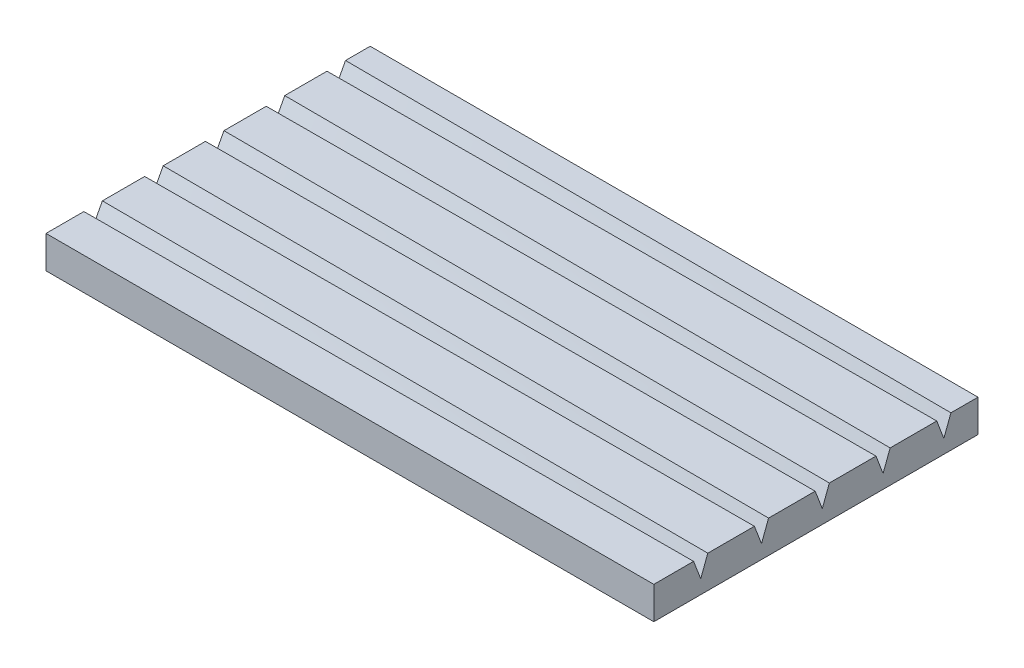
ISO-10303-21;
HEADER;
FILE_DESCRIPTION(('STEP AP214'),'2;1');
FILE_NAME('part.step','',(''),(''),'','','');
FILE_SCHEMA(('AUTOMOTIVE_DESIGN { 1 0 10303 214 1 1 1 1 }'));
ENDSEC;
DATA;
#1=APPLICATION_CONTEXT('core data for automotive mechanical design processes');
#2=APPLICATION_PROTOCOL_DEFINITION('international standard','automotive_design',2000,#1);
#3=PRODUCT_CONTEXT('',#1,'mechanical');
#4=PRODUCT('Part','Part','',(#3));
#5=PRODUCT_RELATED_PRODUCT_CATEGORY('part','',(#4));
#6=PRODUCT_DEFINITION_FORMATION('','',#4);
#7=PRODUCT_DEFINITION_CONTEXT('part definition',#1,'design');
#8=PRODUCT_DEFINITION('design','',#6,#7);
#9=PRODUCT_DEFINITION_SHAPE('','',#8);
#10=(LENGTH_UNIT() NAMED_UNIT(*) SI_UNIT(.MILLI.,.METRE.));
#11=(NAMED_UNIT(*) PLANE_ANGLE_UNIT() SI_UNIT($,.RADIAN.));
#12=(NAMED_UNIT(*) SI_UNIT($,.STERADIAN.) SOLID_ANGLE_UNIT());
#13=UNCERTAINTY_MEASURE_WITH_UNIT(LENGTH_MEASURE(1.E-05),#10,'distance_accuracy_value','');
#14=(GEOMETRIC_REPRESENTATION_CONTEXT(3) GLOBAL_UNCERTAINTY_ASSIGNED_CONTEXT((#13)) GLOBAL_UNIT_ASSIGNED_CONTEXT((#10,
#11,#12)) REPRESENTATION_CONTEXT('',''));
#15=CARTESIAN_POINT('',(0.,0.,0.));
#16=DIRECTION('',(0.,0.,1.));
#17=DIRECTION('',(1.,0.,0.));
#18=AXIS2_PLACEMENT_3D('',#15,#16,#17);
#19=CARTESIAN_POINT('',(0.,8.,0.));
#20=DIRECTION('',(0.,1.,0.));
#21=DIRECTION('',(0.,0.,1.));
#22=AXIS2_PLACEMENT_3D('',#19,#20,#21);
#23=PLANE('',#22);
#24=CARTESIAN_POINT('',(74.7649374249261,8.,26.7048154675276));
#25=CARTESIAN_POINT('',(70.9934003587847,8.,26.6897343569756));
#26=CARTESIAN_POINT('',(67.2218632607946,8.,26.6746612097736));
#27=CARTESIAN_POINT('',(55.9072518713356,8.,26.6294656582195));
#28=CARTESIAN_POINT('',(48.3641774844286,8.,26.5993671439193));
#29=CARTESIAN_POINT('',(33.2780284566883,8.00000000000001,26.5392338221327));
#30=CARTESIAN_POINT('',(25.7349538158551,8.,26.5091990146463));
#31=CARTESIAN_POINT('',(10.4063011195098,8.,26.4482285381422));
#32=CARTESIAN_POINT('',(2.62072305572011,8.,26.4172949501649));
#33=CARTESIAN_POINT('',(-12.9504333412093,8.,26.3554956431228));
#34=CARTESIAN_POINT('',(-20.7360116743489,8.,26.3246299240582));
#35=CARTESIAN_POINT('',(-44.0927470827409,8.00000000000001,26.232134570224));
#36=CARTESIAN_POINT('',(-59.6639045611979,8.00000000000002,26.1706067388374));
#37=CARTESIAN_POINT('',(-75.2350625750739,8.,26.1092146453315));
#38=B_SPLINE_CURVE_WITH_KNOTS('',3,(#24,#25,#26,#27,#28,#29,#30,#31,#32,#33,#34,#35,#36,#37),
.UNSPECIFIED.,.F.,.F.,(4,2,2,2,2,2,4),(0.,11.3147016545169,33.9441049637019,56.573508272887,
79.9304268207998,103.287345368712,150.001182481843),.UNSPECIFIED.);
#39=CARTESIAN_POINT('',(74.7649374249261,8.,26.7048154675276));
#40=VERTEX_POINT('',#39);
#41=CARTESIAN_POINT('',(-75.2350625750739,8.,26.1092146453315));
#42=VERTEX_POINT('',#41);
#43=EDGE_CURVE('E12',#40,#42,#38,.T.);
#44=ORIENTED_EDGE('',*,*,#43,.F.);
#45=DIRECTION('',(0.,0.,-1.));
#46=VECTOR('',#45,1.);
#47=CARTESIAN_POINT('',(74.7649374249261,8.,-39.9777784756404));
#48=LINE('',#47,#46);
#49=CARTESIAN_POINT('',(74.7649374249261,8.,15.1994731491376));
#50=VERTEX_POINT('',#49);
#51=EDGE_CURVE('E290',#40,#50,#48,.T.);
#52=ORIENTED_EDGE('',*,*,#51,.T.);
#53=CARTESIAN_POINT('',(-75.2350625750739,8.,15.6793368432754));
#54=CARTESIAN_POINT('',(-71.5510321467159,8.,15.6676138720796));
#55=CARTESIAN_POINT('',(-67.8670017330216,8.,15.6558862901102));
#56=CARTESIAN_POINT('',(-49.4468497377665,8.,15.5972253263962));
#57=CARTESIAN_POINT('',(-34.7107283763746,8.00000000000001,15.5502227830518));
#58=CARTESIAN_POINT('',(-12.6065466879932,8.,15.4796083094906));
#59=CARTESIAN_POINT('',(-5.23848618418517,8.,15.4560517085462));
#60=CARTESIAN_POINT('',(14.2354684400598,8.,15.3937423204483));
#61=CARTESIAN_POINT('',(26.3413624602254,8.,15.3549581887989));
#62=CARTESIAN_POINT('',(50.5531501819531,8.,15.2772903503372));
#63=CARTESIAN_POINT('',(62.6590438835153,8.,15.2384066435248));
#64=CARTESIAN_POINT('',(74.7649374249261,8.,15.1994731491376));
#65=B_SPLINE_CURVE_WITH_KNOTS('',3,(#53,#54,#55,#56,#57,#58,#59,#60,#61,#62,#63,#64),
.UNSPECIFIED.,.F.,.F.,(4,2,2,2,2,4),(0.,11.0521472405373,55.2607362032059,77.3650306843325,
113.682899125296,150.000767568717),.UNSPECIFIED.);
#66=CARTESIAN_POINT('',(-75.2350625750739,8.,15.6793368432754));
#67=VERTEX_POINT('',#66);
#68=EDGE_CURVE('E328',#67,#50,#65,.T.);
#69=ORIENTED_EDGE('',*,*,#68,.F.);
#70=DIRECTION('',(0.,0.,1.));
#71=VECTOR('',#70,1.);
#72=CARTESIAN_POINT('',(-75.2350625750739,8.,-39.9777784756404));
#73=LINE('',#72,#71);
#74=EDGE_CURVE('E326',#67,#42,#73,.T.);
#75=ORIENTED_EDGE('',*,*,#74,.T.);
#76=EDGE_LOOP('',(#44,#52,#69,#75));
#77=FACE_BOUND('',#76,.T.);
#78=ADVANCED_FACE('F75',(#77),#23,.T.);
#79=CARTESIAN_POINT('',(74.7649374249261,8.,11.7048154675276));
#80=CARTESIAN_POINT('',(70.9934003587847,8.,11.6897343569756));
#81=CARTESIAN_POINT('',(67.2218632607946,8.,11.6746612097736));
#82=CARTESIAN_POINT('',(55.9072518713356,8.,11.6294656582195));
#83=CARTESIAN_POINT('',(48.3641774844286,8.,11.5993671439193));
#84=CARTESIAN_POINT('',(33.2780284566883,8.00000000000001,11.5392338221327));
#85=CARTESIAN_POINT('',(25.7349538158551,8.,11.5091990146463));
#86=CARTESIAN_POINT('',(10.4063011195098,8.,11.4482285381422));
#87=CARTESIAN_POINT('',(2.62072305572011,8.,11.4172949501649));
#88=CARTESIAN_POINT('',(-12.9504333412093,8.,11.3554956431228));
#89=CARTESIAN_POINT('',(-20.7360116743489,8.,11.3246299240582));
#90=CARTESIAN_POINT('',(-44.0927470827409,8.00000000000001,11.232134570224));
#91=CARTESIAN_POINT('',(-59.6639045611979,8.00000000000002,11.1706067388375));
#92=CARTESIAN_POINT('',(-75.2350625750739,8.,11.1092146453315));
#93=B_SPLINE_CURVE_WITH_KNOTS('',3,(#79,#80,#81,#82,#83,#84,#85,#86,#87,#88,#89,#90,#91,#92),
.UNSPECIFIED.,.F.,.F.,(4,2,2,2,2,2,4),(0.,11.3147016545169,33.9441049637019,56.573508272887,
79.9304268207998,103.287345368712,150.001182481843),.UNSPECIFIED.);
#94=CARTESIAN_POINT('',(74.7649374249261,8.,11.7048154675276));
#95=VERTEX_POINT('',#94);
#96=CARTESIAN_POINT('',(-75.2350625750739,8.,11.1092146453315));
#97=VERTEX_POINT('',#96);
#98=EDGE_CURVE('E289',#95,#97,#93,.T.);
#99=ORIENTED_EDGE('',*,*,#98,.F.);
#100=CARTESIAN_POINT('',(74.7649374249261,8.,0.199473149137583));
#101=VERTEX_POINT('',#100);
#102=EDGE_CURVE('E295',#95,#101,#48,.T.);
#103=ORIENTED_EDGE('',*,*,#102,.T.);
#104=CARTESIAN_POINT('',(-75.2350625750739,8.,0.679336843275438));
#105=CARTESIAN_POINT('',(-71.5510321467159,8.,0.667613872079558));
#106=CARTESIAN_POINT('',(-67.8670017330216,8.,0.6558862901102));
#107=CARTESIAN_POINT('',(-49.4468497377665,8.,0.597225326396249));
#108=CARTESIAN_POINT('',(-34.7107283763746,8.00000000000001,0.550222783051821));
#109=CARTESIAN_POINT('',(-12.6065466879932,8.,0.479608309490626));
#110=CARTESIAN_POINT('',(-5.23848618418517,8.,0.456051708546246));
#111=CARTESIAN_POINT('',(14.2354684400598,8.,0.393742320448316));
#112=CARTESIAN_POINT('',(26.3413624602254,8.,0.354958188798946));
#113=CARTESIAN_POINT('',(50.5531501819531,8.,0.277290350337199));
#114=CARTESIAN_POINT('',(62.6590438835153,8.,0.238406643524816));
#115=CARTESIAN_POINT('',(74.7649374249261,8.,0.199473149137583));
#116=B_SPLINE_CURVE_WITH_KNOTS('',3,(#104,#105,#106,#107,#108,#109,#110,#111,#112,#113,#114,
#115),.UNSPECIFIED.,.F.,.F.,(4,2,2,2,2,4),(0.,11.0521472405373,55.2607362032059,
77.3650306843325,113.682899125296,150.000767568717),.UNSPECIFIED.);
#117=CARTESIAN_POINT('',(-75.2350625750739,8.,0.679336843275438));
#118=VERTEX_POINT('',#117);
#119=EDGE_CURVE('E559',#118,#101,#116,.T.);
#120=ORIENTED_EDGE('',*,*,#119,.F.);
#121=EDGE_CURVE('E438',#118,#97,#73,.T.);
#122=ORIENTED_EDGE('',*,*,#121,.T.);
#123=EDGE_LOOP('',(#99,#103,#120,#122));
#124=FACE_BOUND('',#123,.T.);
#125=ADVANCED_FACE('F626',(#124),#23,.T.);
#126=CARTESIAN_POINT('',(74.7649374249261,8.,-3.29518453247239));
#127=CARTESIAN_POINT('',(70.9934003587847,8.,-3.31026564302442));
#128=CARTESIAN_POINT('',(67.2218632607946,8.,-3.32533879022637));
#129=CARTESIAN_POINT('',(55.9072518713356,8.,-3.37053434178047));
#130=CARTESIAN_POINT('',(48.3641774844286,8.,-3.4006328560807));
#131=CARTESIAN_POINT('',(33.2780284566883,8.00000000000001,-3.4607661778673));
#132=CARTESIAN_POINT('',(25.7349538158551,8.,-3.49080098535366));
#133=CARTESIAN_POINT('',(10.4063011195098,8.,-3.55177146185777));
#134=CARTESIAN_POINT('',(2.62072305572011,8.,-3.58270504983512));
#135=CARTESIAN_POINT('',(-12.9504333412093,8.,-3.64450435687715));
#136=CARTESIAN_POINT('',(-20.7360116743489,8.,-3.67537007594184));
#137=CARTESIAN_POINT('',(-44.0927470827409,8.00000000000001,-3.76786542977598));
#138=CARTESIAN_POINT('',(-59.6639045611979,8.00000000000002,-3.82939326116255));
#139=CARTESIAN_POINT('',(-75.2350625750739,8.,-3.89078535466853));
#140=B_SPLINE_CURVE_WITH_KNOTS('',3,(#126,#127,#128,#129,#130,#131,#132,#133,#134,#135,#136,
#137,#138,#139),.UNSPECIFIED.,.F.,.F.,(4,2,2,2,2,2,4),(0.,11.3147016545169,33.9441049637019,
56.573508272887,79.9304268207998,103.287345368712,150.001182481843),.UNSPECIFIED.);
#141=CARTESIAN_POINT('',(74.7649374249261,8.00000000000001,-3.29518453247239));
#142=VERTEX_POINT('',#141);
#143=CARTESIAN_POINT('',(-75.2350625750739,8.,-3.89078535466853));
#144=VERTEX_POINT('',#143);
#145=EDGE_CURVE('E331',#142,#144,#140,.T.);
#146=ORIENTED_EDGE('',*,*,#145,.F.);
#147=CARTESIAN_POINT('',(74.7649374249261,8.,-14.8005268508624));
#148=VERTEX_POINT('',#147);
#149=EDGE_CURVE('E319',#142,#148,#48,.T.);
#150=ORIENTED_EDGE('',*,*,#149,.T.);
#151=CARTESIAN_POINT('',(-75.2350625750739,8.,-14.3206631567246));
#152=CARTESIAN_POINT('',(-71.5510321467159,8.,-14.3323861279204));
#153=CARTESIAN_POINT('',(-67.8670017330216,8.,-14.3441137098898));
#154=CARTESIAN_POINT('',(-49.4468497377665,8.,-14.4027746736038));
#155=CARTESIAN_POINT('',(-34.7107283763746,8.,-14.4497772169482));
#156=CARTESIAN_POINT('',(-12.6065466879932,8.,-14.5203916905094));
#157=CARTESIAN_POINT('',(-5.23848618418517,8.,-14.5439482914538));
#158=CARTESIAN_POINT('',(14.2354684400598,8.,-14.6062576795517));
#159=CARTESIAN_POINT('',(26.3413624602254,8.,-14.6450418112011));
#160=CARTESIAN_POINT('',(50.5531501819531,8.,-14.7227096496628));
#161=CARTESIAN_POINT('',(62.6590438835153,8.,-14.7615933564752));
#162=CARTESIAN_POINT('',(74.7649374249261,8.,-14.8005268508624));
#163=B_SPLINE_CURVE_WITH_KNOTS('',3,(#151,#152,#153,#154,#155,#156,#157,#158,#159,#160,#161,
#162),.UNSPECIFIED.,.F.,.F.,(4,2,2,2,2,4),(0.,11.0521472405373,55.2607362032059,
77.3650306843325,113.682899125296,150.000767568717),.UNSPECIFIED.);
#164=CARTESIAN_POINT('',(-75.2350625750739,8.,-14.3206631567246));
#165=VERTEX_POINT('',#164);
#166=EDGE_CURVE('E552',#165,#148,#163,.T.);
#167=ORIENTED_EDGE('',*,*,#166,.F.);
#168=EDGE_CURVE('E441',#165,#144,#73,.T.);
#169=ORIENTED_EDGE('',*,*,#168,.T.);
#170=EDGE_LOOP('',(#146,#150,#167,#169));
#171=FACE_BOUND('',#170,.T.);
#172=ADVANCED_FACE('F619',(#171),#23,.T.);
#173=CARTESIAN_POINT('',(74.7649374249261,8.,-18.2951845324724));
#174=CARTESIAN_POINT('',(70.9934003587847,8.,-18.3102656430244));
#175=CARTESIAN_POINT('',(67.2218632607946,8.,-18.3253387902264));
#176=CARTESIAN_POINT('',(55.9072518713356,8.,-18.3705343417805));
#177=CARTESIAN_POINT('',(48.3641774844286,8.,-18.4006328560807));
#178=CARTESIAN_POINT('',(33.2780284566883,8.00000000000001,-18.4607661778673));
#179=CARTESIAN_POINT('',(25.7349538158551,8.,-18.4908009853537));
#180=CARTESIAN_POINT('',(10.4063011195098,8.,-18.5517714618578));
#181=CARTESIAN_POINT('',(2.62072305572011,8.,-18.5827050498351));
#182=CARTESIAN_POINT('',(-12.9504333412093,8.,-18.6445043568772));
#183=CARTESIAN_POINT('',(-20.7360116743489,8.,-18.6753700759418));
#184=CARTESIAN_POINT('',(-44.0927470827409,8.00000000000001,-18.767865429776));
#185=CARTESIAN_POINT('',(-59.6639045611979,8.00000000000002,-18.8293932611625));
#186=CARTESIAN_POINT('',(-75.2350625750739,8.,-18.8907853546685));
#187=B_SPLINE_CURVE_WITH_KNOTS('',3,(#173,#174,#175,#176,#177,#178,#179,#180,#181,#182,#183,
#184,#185,#186),.UNSPECIFIED.,.F.,.F.,(4,2,2,2,2,2,4),(0.,11.3147016545169,33.9441049637019,
56.573508272887,79.9304268207998,103.287345368712,150.001182481843),.UNSPECIFIED.);
#188=CARTESIAN_POINT('',(74.7649374249261,8.,-18.2951845324724));
#189=VERTEX_POINT('',#188);
#190=CARTESIAN_POINT('',(-75.2350625750739,8.,-18.8907853546685));
#191=VERTEX_POINT('',#190);
#192=EDGE_CURVE('E517',#189,#191,#187,.T.);
#193=ORIENTED_EDGE('',*,*,#192,.F.);
#194=CARTESIAN_POINT('',(74.7649374249261,8.,-29.8005268508624));
#195=VERTEX_POINT('',#194);
#196=EDGE_CURVE('E315',#189,#195,#48,.T.);
#197=ORIENTED_EDGE('',*,*,#196,.T.);
#198=CARTESIAN_POINT('',(-75.2350625750739,8.,-29.3206631567246));
#199=CARTESIAN_POINT('',(-71.5510321467159,8.,-29.3323861279204));
#200=CARTESIAN_POINT('',(-67.8670017330216,8.,-29.3441137098898));
#201=CARTESIAN_POINT('',(-49.4468497377665,8.,-29.4027746736038));
#202=CARTESIAN_POINT('',(-34.7107283763746,8.,-29.4497772169482));
#203=CARTESIAN_POINT('',(-12.6065466879932,8.,-29.5203916905094));
#204=CARTESIAN_POINT('',(-5.23848618418517,8.,-29.5439482914538));
#205=CARTESIAN_POINT('',(14.2354684400598,8.,-29.6062576795517));
#206=CARTESIAN_POINT('',(26.3413624602254,8.,-29.6450418112011));
#207=CARTESIAN_POINT('',(50.5531501819531,8.,-29.7227096496628));
#208=CARTESIAN_POINT('',(62.6590438835154,8.,-29.7615933564752));
#209=CARTESIAN_POINT('',(74.7649374249261,8.,-29.8005268508624));
#210=B_SPLINE_CURVE_WITH_KNOTS('',3,(#198,#199,#200,#201,#202,#203,#204,#205,#206,#207,#208,
#209),.UNSPECIFIED.,.F.,.F.,(4,2,2,2,2,4),(0.,11.0521472405373,55.2607362032059,
77.3650306843325,113.682899125296,150.000767568717),.UNSPECIFIED.);
#211=CARTESIAN_POINT('',(-75.2350625750739,8.,-29.3206631567246));
#212=VERTEX_POINT('',#211);
#213=EDGE_CURVE('E472',#212,#195,#210,.T.);
#214=ORIENTED_EDGE('',*,*,#213,.F.);
#215=EDGE_CURVE('E476',#212,#191,#73,.T.);
#216=ORIENTED_EDGE('',*,*,#215,.T.);
#217=EDGE_LOOP('',(#193,#197,#214,#216));
#218=FACE_BOUND('',#217,.T.);
#219=ADVANCED_FACE('F663',(#218),#23,.T.);
#220=CARTESIAN_POINT('',(74.7649374249261,8.,-33.2951845324724));
#221=CARTESIAN_POINT('',(70.9934003587847,8.,-33.3102656430244));
#222=CARTESIAN_POINT('',(67.2218632607946,8.,-33.3253387902264));
#223=CARTESIAN_POINT('',(55.9072518713356,8.,-33.3705343417805));
#224=CARTESIAN_POINT('',(48.3641774844286,8.,-33.4006328560807));
#225=CARTESIAN_POINT('',(33.2780284566883,8.00000000000001,-33.4607661778673));
#226=CARTESIAN_POINT('',(25.7349538158551,8.,-33.4908009853537));
#227=CARTESIAN_POINT('',(10.4063011195098,8.,-33.5517714618578));
#228=CARTESIAN_POINT('',(2.6207230557201,8.,-33.5827050498351));
#229=CARTESIAN_POINT('',(-12.9504333412093,8.,-33.6445043568771));
#230=CARTESIAN_POINT('',(-20.7360116743489,8.,-33.6753700759418));
#231=CARTESIAN_POINT('',(-44.0927470827409,8.00000000000001,-33.767865429776));
#232=CARTESIAN_POINT('',(-59.663904561198,8.00000000000002,-33.8293932611626));
#233=CARTESIAN_POINT('',(-75.2350625750739,8.,-33.8907853546685));
#234=B_SPLINE_CURVE_WITH_KNOTS('',3,(#220,#221,#222,#223,#224,#225,#226,#227,#228,#229,#230,
#231,#232,#233),.UNSPECIFIED.,.F.,.F.,(4,2,2,2,2,2,4),(0.,11.3147016545169,33.9441049637019,
56.573508272887,79.9304268207998,103.287345368712,150.001182481843),.UNSPECIFIED.);
#235=CARTESIAN_POINT('',(74.7649374249261,8.,-33.2951845324724));
#236=VERTEX_POINT('',#235);
#237=CARTESIAN_POINT('',(-75.2350625750739,8.,-33.8907853546685));
#238=VERTEX_POINT('',#237);
#239=EDGE_CURVE('E555',#236,#238,#234,.T.);
#240=ORIENTED_EDGE('',*,*,#239,.F.);
#241=CARTESIAN_POINT('',(74.7649374249261,8.,-39.9777784756404));
#242=VERTEX_POINT('',#241);
#243=EDGE_CURVE('E307',#236,#242,#48,.T.);
#244=ORIENTED_EDGE('',*,*,#243,.T.);
#245=DIRECTION('',(-1.,0.,0.));
#246=VECTOR('',#245,1.);
#247=CARTESIAN_POINT('',(-75.2350625750739,8.,-39.9777784756404));
#248=LINE('',#247,#246);
#249=CARTESIAN_POINT('',(-75.2350625750739,8.,-39.9777784756404));
#250=VERTEX_POINT('',#249);
#251=EDGE_CURVE('E302',#242,#250,#248,.T.);
#252=ORIENTED_EDGE('',*,*,#251,.T.);
#253=EDGE_CURVE('E473',#250,#238,#73,.T.);
#254=ORIENTED_EDGE('',*,*,#253,.T.);
#255=EDGE_LOOP('',(#240,#244,#252,#254));
#256=FACE_BOUND('',#255,.T.);
#257=ADVANCED_FACE('F653',(#256),#23,.T.);
#258=CARTESIAN_POINT('',(-75.2350625750739,8.,-39.9777784756404));
#259=DIRECTION('',(1.,0.,0.));
#260=DIRECTION('',(0.,0.,-1.));
#261=AXIS2_PLACEMENT_3D('',#258,#259,#260);
#262=PLANE('',#261);
#263=DIRECTION('',(0.,0.904801554156799,0.425833474019413));
#264=VECTOR('',#263,1.);
#265=CARTESIAN_POINT('',(-75.2350625750739,8.42987780205604,30.8816534253064));
#266=LINE('',#265,#264);
#267=CARTESIAN_POINT('',(-75.2350625750739,3.42987780205604,28.5284662979023));
#268=VERTEX_POINT('',#267);
#269=CARTESIAN_POINT('',(-75.2350625750739,8.,30.6793368432754));
#270=VERTEX_POINT('',#269);
#271=EDGE_CURVE('E93',#268,#270,#266,.T.);
#272=ORIENTED_EDGE('',*,*,#271,.F.);
#273=DIRECTION('',(0.,-0.883805893019747,0.467853762904145));
#274=VECTOR('',#273,1.);
#275=CARTESIAN_POINT('',(-75.2350625750739,3.42987780205604,28.5284662979023));
#276=LINE('',#275,#274);
#277=EDGE_CURVE('E211',#42,#268,#276,.T.);
#278=ORIENTED_EDGE('',*,*,#277,.F.);
#279=ORIENTED_EDGE('',*,*,#74,.F.);
#280=DIRECTION('',(0.,0.904801554156799,0.425833474019413));
#281=VECTOR('',#280,1.);
#282=CARTESIAN_POINT('',(-75.2350625750739,8.42987780205604,15.8816534253064));
#283=LINE('',#282,#281);
#284=CARTESIAN_POINT('',(-75.2350625750739,3.42987780205604,13.5284662979023));
#285=VERTEX_POINT('',#284);
#286=EDGE_CURVE('E101',#285,#67,#283,.T.);
#287=ORIENTED_EDGE('',*,*,#286,.F.);
#288=DIRECTION('',(0.,-0.883805893019747,0.467853762904145));
#289=VECTOR('',#288,1.);
#290=CARTESIAN_POINT('',(-75.2350625750739,3.42987780205604,13.5284662979023));
#291=LINE('',#290,#289);
#292=EDGE_CURVE('E242',#97,#285,#291,.T.);
#293=ORIENTED_EDGE('',*,*,#292,.F.);
#294=ORIENTED_EDGE('',*,*,#121,.F.);
#295=DIRECTION('',(0.,0.904801554156799,0.425833474019413));
#296=VECTOR('',#295,1.);
#297=CARTESIAN_POINT('',(-75.2350625750739,8.42987780205604,0.881653425306449));
#298=LINE('',#297,#296);
#299=CARTESIAN_POINT('',(-75.2350625750739,3.42987780205604,-1.47153370209772));
#300=VERTEX_POINT('',#299);
#301=EDGE_CURVE('E390',#300,#118,#298,.T.);
#302=ORIENTED_EDGE('',*,*,#301,.F.);
#303=DIRECTION('',(0.,-0.883805893019747,0.467853762904145));
#304=VECTOR('',#303,1.);
#305=CARTESIAN_POINT('',(-75.2350625750739,3.42987780205604,-1.47153370209772));
#306=LINE('',#305,#304);
#307=EDGE_CURVE('E393',#144,#300,#306,.T.);
#308=ORIENTED_EDGE('',*,*,#307,.F.);
#309=ORIENTED_EDGE('',*,*,#168,.F.);
#310=DIRECTION('',(0.,0.904801554156799,0.425833474019413));
#311=VECTOR('',#310,1.);
#312=CARTESIAN_POINT('',(-75.2350625750739,8.42987780205604,-14.1183465746936));
#313=LINE('',#312,#311);
#314=CARTESIAN_POINT('',(-75.2350625750739,3.42987780205604,-16.4715337020977));
#315=VERTEX_POINT('',#314);
#316=EDGE_CURVE('E492',#315,#165,#313,.T.);
#317=ORIENTED_EDGE('',*,*,#316,.F.);
#318=DIRECTION('',(0.,-0.883805893019747,0.467853762904145));
#319=VECTOR('',#318,1.);
#320=CARTESIAN_POINT('',(-75.2350625750739,3.42987780205604,-16.4715337020977));
#321=LINE('',#320,#319);
#322=EDGE_CURVE('E380',#191,#315,#321,.T.);
#323=ORIENTED_EDGE('',*,*,#322,.F.);
#324=ORIENTED_EDGE('',*,*,#215,.F.);
#325=DIRECTION('',(0.,0.904801554156799,0.425833474019413));
#326=VECTOR('',#325,1.);
#327=CARTESIAN_POINT('',(-75.2350625750739,8.42987780205604,-29.1183465746936));
#328=LINE('',#327,#326);
#329=CARTESIAN_POINT('',(-75.2350625750739,3.42987780205604,-31.4715337020977));
#330=VERTEX_POINT('',#329);
#331=EDGE_CURVE('E593',#330,#212,#328,.T.);
#332=ORIENTED_EDGE('',*,*,#331,.F.);
#333=DIRECTION('',(0.,-0.883805893019747,0.467853762904145));
#334=VECTOR('',#333,1.);
#335=CARTESIAN_POINT('',(-75.2350625750739,3.42987780205604,-31.4715337020977));
#336=LINE('',#335,#334);
#337=EDGE_CURVE('E510',#238,#330,#336,.T.);
#338=ORIENTED_EDGE('',*,*,#337,.F.);
#339=ORIENTED_EDGE('',*,*,#253,.F.);
#340=DIRECTION('',(0.,-1.,0.));
#341=VECTOR('',#340,1.);
#342=CARTESIAN_POINT('',(-75.2350625750739,8.,-39.9777784756404));
#343=LINE('',#342,#341);
#344=CARTESIAN_POINT('',(-75.2350625750739,0.,-39.9777784756404));
#345=VERTEX_POINT('',#344);
#346=EDGE_CURVE('E458',#250,#345,#343,.T.);
#347=ORIENTED_EDGE('',*,*,#346,.T.);
#348=DIRECTION('',(0.,0.,1.));
#349=VECTOR('',#348,1.);
#350=CARTESIAN_POINT('',(-75.2350625750739,0.,-39.9777784756404));
#351=LINE('',#350,#349);
#352=CARTESIAN_POINT('',(-75.2350625750739,0.,40.0222215243596));
#353=VERTEX_POINT('',#352);
#354=EDGE_CURVE('E583',#345,#353,#351,.T.);
#355=ORIENTED_EDGE('',*,*,#354,.T.);
#356=DIRECTION('',(0.,-1.,0.));
#357=VECTOR('',#356,1.);
#358=CARTESIAN_POINT('',(-75.2350625750739,8.,40.0222215243596));
#359=LINE('',#358,#357);
#360=CARTESIAN_POINT('',(-75.2350625750739,8.,40.0222215243596));
#361=VERTEX_POINT('',#360);
#362=EDGE_CURVE('E468',#361,#353,#359,.T.);
#363=ORIENTED_EDGE('',*,*,#362,.F.);
#364=EDGE_CURVE('E228',#270,#361,#73,.T.);
#365=ORIENTED_EDGE('',*,*,#364,.F.);
#366=EDGE_LOOP('',(#272,#278,#279,#287,#293,#294,#302,#308,#309,#317,#323,#324,#332,#338,#339,
#347,#355,#363,#365));
#367=FACE_BOUND('',#366,.T.);
#368=ADVANCED_FACE('F77',(#367),#262,.F.);
#369=CARTESIAN_POINT('',(-75.2350625750739,8.,40.0222215243596));
#370=DIRECTION('',(0.,0.,-1.));
#371=DIRECTION('',(-1.,0.,0.));
#372=AXIS2_PLACEMENT_3D('',#369,#370,#371);
#373=PLANE('',#372);
#374=DIRECTION('',(1.,0.,0.));
#375=VECTOR('',#374,1.);
#376=CARTESIAN_POINT('',(-75.2350625750739,0.,40.0222215243596));
#377=LINE('',#376,#375);
#378=CARTESIAN_POINT('',(74.7649374249261,0.,40.0222215243596));
#379=VERTEX_POINT('',#378);
#380=EDGE_CURVE('E454',#353,#379,#377,.T.);
#381=ORIENTED_EDGE('',*,*,#380,.T.);
#382=DIRECTION('',(0.,-1.,0.));
#383=VECTOR('',#382,1.);
#384=CARTESIAN_POINT('',(74.7649374249261,8.,40.0222215243596));
#385=LINE('',#384,#383);
#386=CARTESIAN_POINT('',(74.7649374249261,8.,40.0222215243596));
#387=VERTEX_POINT('',#386);
#388=EDGE_CURVE('E464',#387,#379,#385,.T.);
#389=ORIENTED_EDGE('',*,*,#388,.F.);
#390=DIRECTION('',(1.,0.,0.));
#391=VECTOR('',#390,1.);
#392=CARTESIAN_POINT('',(-75.2350625750739,8.,40.0222215243596));
#393=LINE('',#392,#391);
#394=EDGE_CURVE('E301',#361,#387,#393,.T.);
#395=ORIENTED_EDGE('',*,*,#394,.F.);
#396=ORIENTED_EDGE('',*,*,#362,.T.);
#397=EDGE_LOOP('',(#381,#389,#395,#396));
#398=FACE_BOUND('',#397,.T.);
#399=ADVANCED_FACE('F648',(#398),#373,.F.);
#400=CARTESIAN_POINT('',(74.7649374249261,8.,-39.9777784756404));
#401=DIRECTION('',(-1.,0.,0.));
#402=DIRECTION('',(0.,0.,1.));
#403=AXIS2_PLACEMENT_3D('',#400,#401,#402);
#404=PLANE('',#403);
#405=ORIENTED_EDGE('',*,*,#51,.F.);
#406=DIRECTION('',(0.,-0.934783580588349,0.355217760623572));
#407=VECTOR('',#406,1.);
#408=CARTESIAN_POINT('',(74.7649374249261,3.40176620840793,28.4521443083326));
#409=LINE('',#408,#407);
#410=CARTESIAN_POINT('',(74.7649374249261,3.40176620840793,28.4521443083326));
#411=VERTEX_POINT('',#410);
#412=EDGE_CURVE('E224',#40,#411,#409,.T.);
#413=ORIENTED_EDGE('',*,*,#412,.T.);
#414=DIRECTION('',(0.,0.934783580588349,0.355217760623573));
#415=VECTOR('',#414,1.);
#416=CARTESIAN_POINT('',(74.7649374249261,8.40176620840793,30.3521443083326));
#417=LINE('',#416,#415);
#418=CARTESIAN_POINT('',(74.7649374249261,8.,30.1994731491376));
#419=VERTEX_POINT('',#418);
#420=EDGE_CURVE('E222',#411,#419,#417,.T.);
#421=ORIENTED_EDGE('',*,*,#420,.T.);
#422=EDGE_CURVE('E294',#387,#419,#48,.T.);
#423=ORIENTED_EDGE('',*,*,#422,.F.);
#424=ORIENTED_EDGE('',*,*,#388,.T.);
#425=DIRECTION('',(0.,0.,-1.));
#426=VECTOR('',#425,1.);
#427=CARTESIAN_POINT('',(74.7649374249261,0.,-39.9777784756404));
#428=LINE('',#427,#426);
#429=CARTESIAN_POINT('',(74.7649374249261,0.,-39.9777784756404));
#430=VERTEX_POINT('',#429);
#431=EDGE_CURVE('E446',#379,#430,#428,.T.);
#432=ORIENTED_EDGE('',*,*,#431,.T.);
#433=DIRECTION('',(0.,-1.,0.));
#434=VECTOR('',#433,1.);
#435=CARTESIAN_POINT('',(74.7649374249261,8.,-39.9777784756404));
#436=LINE('',#435,#434);
#437=EDGE_CURVE('E461',#242,#430,#436,.T.);
#438=ORIENTED_EDGE('',*,*,#437,.F.);
#439=ORIENTED_EDGE('',*,*,#243,.F.);
#440=DIRECTION('',(0.,-0.934783580588349,0.355217760623572));
#441=VECTOR('',#440,1.);
#442=CARTESIAN_POINT('',(74.7649374249261,3.40176620840793,-31.5478556916674));
#443=LINE('',#442,#441);
#444=CARTESIAN_POINT('',(74.7649374249261,3.40176620840793,-31.5478556916674));
#445=VERTEX_POINT('',#444);
#446=EDGE_CURVE('E584',#236,#445,#443,.T.);
#447=ORIENTED_EDGE('',*,*,#446,.T.);
#448=DIRECTION('',(0.,0.934783580588349,0.355217760623573));
#449=VECTOR('',#448,1.);
#450=CARTESIAN_POINT('',(74.7649374249261,8.40176620840793,-29.6478556916674));
#451=LINE('',#450,#449);
#452=EDGE_CURVE('E579',#445,#195,#451,.T.);
#453=ORIENTED_EDGE('',*,*,#452,.T.);
#454=ORIENTED_EDGE('',*,*,#196,.F.);
#455=DIRECTION('',(0.,-0.934783580588349,0.355217760623572));
#456=VECTOR('',#455,1.);
#457=CARTESIAN_POINT('',(74.7649374249261,3.40176620840793,-16.5478556916674));
#458=LINE('',#457,#456);
#459=CARTESIAN_POINT('',(74.7649374249261,3.40176620840793,-16.5478556916674));
#460=VERTEX_POINT('',#459);
#461=EDGE_CURVE('E500',#189,#460,#458,.T.);
#462=ORIENTED_EDGE('',*,*,#461,.T.);
#463=DIRECTION('',(0.,0.934783580588349,0.355217760623573));
#464=VECTOR('',#463,1.);
#465=CARTESIAN_POINT('',(74.7649374249261,8.40176620840793,-14.6478556916674));
#466=LINE('',#465,#464);
#467=EDGE_CURVE('E504',#460,#148,#466,.T.);
#468=ORIENTED_EDGE('',*,*,#467,.T.);
#469=ORIENTED_EDGE('',*,*,#149,.F.);
#470=DIRECTION('',(0.,-0.934783580588349,0.355217760623572));
#471=VECTOR('',#470,1.);
#472=CARTESIAN_POINT('',(74.7649374249261,3.40176620840793,-1.5478556916674));
#473=LINE('',#472,#471);
#474=CARTESIAN_POINT('',(74.7649374249261,3.40176620840793,-1.5478556916674));
#475=VERTEX_POINT('',#474);
#476=EDGE_CURVE('E381',#142,#475,#473,.T.);
#477=ORIENTED_EDGE('',*,*,#476,.T.);
#478=DIRECTION('',(0.,0.934783580588349,0.355217760623573));
#479=VECTOR('',#478,1.);
#480=CARTESIAN_POINT('',(74.7649374249261,8.40176620840793,0.352144308332598));
#481=LINE('',#480,#479);
#482=EDGE_CURVE('E376',#475,#101,#481,.T.);
#483=ORIENTED_EDGE('',*,*,#482,.T.);
#484=ORIENTED_EDGE('',*,*,#102,.F.);
#485=DIRECTION('',(0.,-0.934783580588349,0.355217760623572));
#486=VECTOR('',#485,1.);
#487=CARTESIAN_POINT('',(74.7649374249261,3.40176620840793,13.4521443083326));
#488=LINE('',#487,#486);
#489=CARTESIAN_POINT('',(74.7649374249261,3.40176620840793,13.4521443083326));
#490=VERTEX_POINT('',#489);
#491=EDGE_CURVE('E404',#95,#490,#488,.T.);
#492=ORIENTED_EDGE('',*,*,#491,.T.);
#493=DIRECTION('',(0.,0.934783580588349,0.355217760623573));
#494=VECTOR('',#493,1.);
#495=CARTESIAN_POINT('',(74.7649374249261,8.40176620840793,15.3521443083326));
#496=LINE('',#495,#494);
#497=EDGE_CURVE('E397',#490,#50,#496,.T.);
#498=ORIENTED_EDGE('',*,*,#497,.T.);
#499=EDGE_LOOP('',(#405,#413,#421,#423,#424,#432,#438,#439,#447,#453,#454,#462,#468,#469,#477,
#483,#484,#492,#498));
#500=FACE_BOUND('',#499,.T.);
#501=ADVANCED_FACE('F635',(#500),#404,.F.);
#502=CARTESIAN_POINT('',(-75.2350625750739,8.,-39.9777784756404));
#503=DIRECTION('',(0.,0.,1.));
#504=DIRECTION('',(1.,0.,0.));
#505=AXIS2_PLACEMENT_3D('',#502,#503,#504);
#506=PLANE('',#505);
#507=DIRECTION('',(-1.,0.,0.));
#508=VECTOR('',#507,1.);
#509=CARTESIAN_POINT('',(-75.2350625750739,0.,-39.9777784756404));
#510=LINE('',#509,#508);
#511=EDGE_CURVE('E442',#430,#345,#510,.T.);
#512=ORIENTED_EDGE('',*,*,#511,.T.);
#513=ORIENTED_EDGE('',*,*,#346,.F.);
#514=ORIENTED_EDGE('',*,*,#251,.F.);
#515=ORIENTED_EDGE('',*,*,#437,.T.);
#516=EDGE_LOOP('',(#512,#513,#514,#515));
#517=FACE_BOUND('',#516,.T.);
#518=ADVANCED_FACE('F654',(#517),#506,.F.);
#519=CARTESIAN_POINT('',(-75.2350625750739,8.,30.6793368432754));
#520=CARTESIAN_POINT('',(-71.5510321467159,8.,30.6676138720796));
#521=CARTESIAN_POINT('',(-67.8670017330216,8.,30.6558862901102));
#522=CARTESIAN_POINT('',(-49.4468497377665,8.,30.5972253263963));
#523=CARTESIAN_POINT('',(-34.7107283763746,8.,30.5502227830518));
#524=CARTESIAN_POINT('',(-12.6065466879932,8.,30.4796083094906));
#525=CARTESIAN_POINT('',(-5.23848618418516,8.,30.4560517085462));
#526=CARTESIAN_POINT('',(14.2354684400598,8.,30.3937423204483));
#527=CARTESIAN_POINT('',(26.3413624602254,8.,30.3549581887989));
#528=CARTESIAN_POINT('',(50.5531501819531,8.,30.2772903503372));
#529=CARTESIAN_POINT('',(62.6590438835153,8.,30.2384066435248));
#530=CARTESIAN_POINT('',(74.7649374249261,8.,30.1994731491376));
#531=B_SPLINE_CURVE_WITH_KNOTS('',3,(#519,#520,#521,#522,#523,#524,#525,#526,#527,#528,#529,
#530),.UNSPECIFIED.,.F.,.F.,(4,2,2,2,2,4),(0.,11.0521472405373,55.2607362032059,
77.3650306843325,113.682899125296,150.000767568717),.UNSPECIFIED.);
#532=EDGE_CURVE('E85',#270,#419,#531,.T.);
#533=ORIENTED_EDGE('',*,*,#532,.F.);
#534=ORIENTED_EDGE('',*,*,#364,.T.);
#535=ORIENTED_EDGE('',*,*,#394,.T.);
#536=ORIENTED_EDGE('',*,*,#422,.T.);
#537=EDGE_LOOP('',(#533,#534,#535,#536));
#538=FACE_BOUND('',#537,.T.);
#539=ADVANCED_FACE('F251',(#538),#23,.T.);
#540=CARTESIAN_POINT('',(0.,0.,0.));
#541=DIRECTION('',(0.,1.,0.));
#542=DIRECTION('',(0.,0.,1.));
#543=AXIS2_PLACEMENT_3D('',#540,#541,#542);
#544=PLANE('',#543);
#545=ORIENTED_EDGE('',*,*,#354,.F.);
#546=ORIENTED_EDGE('',*,*,#511,.F.);
#547=ORIENTED_EDGE('',*,*,#431,.F.);
#548=ORIENTED_EDGE('',*,*,#380,.F.);
#549=EDGE_LOOP('',(#545,#546,#547,#548));
#550=FACE_BOUND('',#549,.T.);
#551=ADVANCED_FACE('F658',(#550),#544,.F.);
#552=CARTESIAN_POINT('',(-75.2350625750739,3.42987780205604,-31.4715337020977));
#553=CARTESIAN_POINT('',(74.7649374249261,3.40176620840793,-31.5478556916674));
#554=CARTESIAN_POINT('',(-75.2350625750739,4.26321113538937,-31.9126691808637));
#555=CARTESIAN_POINT('',(74.7649374249261,4.23509954174129,-31.8645223583341));
#556=CARTESIAN_POINT('',(-75.2350625750739,5.09654446872271,-32.3538046596297));
#557=CARTESIAN_POINT('',(74.7649374249261,5.06843287507463,-32.1811890250007));
#558=CARTESIAN_POINT('',(-75.2350625750739,6.76321113538937,-33.2360756171616));
#559=CARTESIAN_POINT('',(74.7649374249261,6.73509954174129,-32.8145223583341));
#560=CARTESIAN_POINT('',(-75.2350625750739,7.5965444687227,-33.6772110959276));
#561=CARTESIAN_POINT('',(74.7649374249261,7.56843287507462,-33.1311890250007));
#562=CARTESIAN_POINT('',(-75.2350625750739,8.42987780205604,-34.1183465746936));
#563=CARTESIAN_POINT('',(74.7649374249261,8.40176620840793,-33.4478556916674));
#564=B_SPLINE_SURFACE_WITH_KNOTS('',3,1,((#552,#553),(#554,#555),(#556,#557),(#558,#559),(#560,
#561),(#562,#563)),.UNSPECIFIED.,.F.,.F.,.F.,(4,2,4),(2,2),(0.,0.5,1.),(0.,1.),.UNSPECIFIED.);
#565=DIRECTION('',(-0.999999852993193,0.000187410596770054,0.000508813188998902));
#566=VECTOR('',#565,1.);
#567=CARTESIAN_POINT('',(-0.235062575073872,3.41582200523199,-31.5096946968826));
#568=LINE('',#567,#566);
#569=EDGE_CURVE('E590',#445,#330,#568,.T.);
#570=ORIENTED_EDGE('',*,*,#239,.T.);
#571=ORIENTED_EDGE('',*,*,#337,.T.);
#572=ORIENTED_EDGE('',*,*,#569,.F.);
#573=ORIENTED_EDGE('',*,*,#446,.F.);
#574=EDGE_LOOP('',(#570,#571,#572,#573));
#575=FACE_BOUND('',#574,.T.);
#576=ADVANCED_FACE('F538',(#575),#564,.F.);
#577=CARTESIAN_POINT('',(-75.2350625750739,8.42987780205604,-29.1183465746936));
#578=CARTESIAN_POINT('',(74.7649374249261,8.40176620840793,-29.6478556916674));
#579=CARTESIAN_POINT('',(-75.2350625750739,7.59654446872271,-29.5105444292609));
#580=CARTESIAN_POINT('',(74.7649374249261,7.5684328750746,-29.9645223583341));
#581=CARTESIAN_POINT('',(-75.2350625750739,6.76321113538938,-29.9027422838283));
#582=CARTESIAN_POINT('',(74.7649374249261,6.73509954174127,-30.2811890250007));
#583=CARTESIAN_POINT('',(-75.2350625750739,5.09654446872272,-30.687137992963));
#584=CARTESIAN_POINT('',(74.7649374249261,5.0684328750746,-30.9145223583341));
#585=CARTESIAN_POINT('',(-75.2350625750739,4.26321113538938,-31.0793358475304));
#586=CARTESIAN_POINT('',(74.7649374249261,4.23509954174127,-31.2311890250007));
#587=CARTESIAN_POINT('',(-75.2350625750739,3.42987780205604,-31.4715337020977));
#588=CARTESIAN_POINT('',(74.7649374249261,3.40176620840793,-31.5478556916674));
#589=B_SPLINE_SURFACE_WITH_KNOTS('',3,1,((#577,#578),(#579,#580),(#581,#582),(#583,#584),(#585,
#586),(#587,#588)),.UNSPECIFIED.,.F.,.F.,.F.,(4,2,4),(2,2),(0.,0.5,1.),(0.,1.),.UNSPECIFIED.);
#590=ORIENTED_EDGE('',*,*,#213,.T.);
#591=ORIENTED_EDGE('',*,*,#452,.F.);
#592=ORIENTED_EDGE('',*,*,#569,.T.);
#593=ORIENTED_EDGE('',*,*,#331,.T.);
#594=EDGE_LOOP('',(#590,#591,#592,#593));
#595=FACE_BOUND('',#594,.T.);
#596=ADVANCED_FACE('F525',(#595),#589,.F.);
#597=CARTESIAN_POINT('',(-75.2350625750739,3.42987780205604,-16.4715337020977));
#598=CARTESIAN_POINT('',(74.7649374249261,3.40176620840793,-16.5478556916674));
#599=CARTESIAN_POINT('',(-75.2350625750739,4.26321113538937,-16.9126691808637));
#600=CARTESIAN_POINT('',(74.7649374249261,4.23509954174129,-16.8645223583341));
#601=CARTESIAN_POINT('',(-75.2350625750739,5.09654446872271,-17.3538046596297));
#602=CARTESIAN_POINT('',(74.7649374249261,5.06843287507463,-17.1811890250007));
#603=CARTESIAN_POINT('',(-75.2350625750739,6.76321113538937,-18.2360756171616));
#604=CARTESIAN_POINT('',(74.7649374249261,6.73509954174129,-17.8145223583341));
#605=CARTESIAN_POINT('',(-75.2350625750739,7.5965444687227,-18.6772110959276));
#606=CARTESIAN_POINT('',(74.7649374249261,7.56843287507462,-18.1311890250007));
#607=CARTESIAN_POINT('',(-75.2350625750739,8.42987780205604,-19.1183465746936));
#608=CARTESIAN_POINT('',(74.7649374249261,8.40176620840793,-18.4478556916674));
#609=B_SPLINE_SURFACE_WITH_KNOTS('',3,1,((#597,#598),(#599,#600),(#601,#602),(#603,#604),(#605,
#606),(#607,#608)),.UNSPECIFIED.,.F.,.F.,.F.,(4,2,4),(2,2),(0.,0.5,1.),(0.,1.),.UNSPECIFIED.);
#610=DIRECTION('',(-0.999999852993193,0.000187410596770054,0.000508813188998902));
#611=VECTOR('',#610,1.);
#612=CARTESIAN_POINT('',(-0.235062575073872,3.41582200523199,-16.5096946968826));
#613=LINE('',#612,#611);
#614=EDGE_CURVE('E497',#460,#315,#613,.T.);
#615=ORIENTED_EDGE('',*,*,#192,.T.);
#616=ORIENTED_EDGE('',*,*,#322,.T.);
#617=ORIENTED_EDGE('',*,*,#614,.F.);
#618=ORIENTED_EDGE('',*,*,#461,.F.);
#619=EDGE_LOOP('',(#615,#616,#617,#618));
#620=FACE_BOUND('',#619,.T.);
#621=ADVANCED_FACE('F519',(#620),#609,.F.);
#622=CARTESIAN_POINT('',(-75.2350625750739,8.42987780205604,-14.1183465746936));
#623=CARTESIAN_POINT('',(74.7649374249261,8.40176620840793,-14.6478556916674));
#624=CARTESIAN_POINT('',(-75.2350625750739,7.59654446872271,-14.5105444292609));
#625=CARTESIAN_POINT('',(74.7649374249261,7.5684328750746,-14.9645223583341));
#626=CARTESIAN_POINT('',(-75.2350625750739,6.76321113538938,-14.9027422838283));
#627=CARTESIAN_POINT('',(74.7649374249261,6.73509954174127,-15.2811890250007));
#628=CARTESIAN_POINT('',(-75.2350625750739,5.09654446872272,-15.687137992963));
#629=CARTESIAN_POINT('',(74.7649374249261,5.0684328750746,-15.9145223583341));
#630=CARTESIAN_POINT('',(-75.2350625750739,4.26321113538938,-16.0793358475304));
#631=CARTESIAN_POINT('',(74.7649374249261,4.23509954174127,-16.2311890250007));
#632=CARTESIAN_POINT('',(-75.2350625750739,3.42987780205604,-16.4715337020977));
#633=CARTESIAN_POINT('',(74.7649374249261,3.40176620840793,-16.5478556916674));
#634=B_SPLINE_SURFACE_WITH_KNOTS('',3,1,((#622,#623),(#624,#625),(#626,#627),(#628,#629),(#630,
#631),(#632,#633)),.UNSPECIFIED.,.F.,.F.,.F.,(4,2,4),(2,2),(0.,0.5,1.),(0.,1.),.UNSPECIFIED.);
#635=ORIENTED_EDGE('',*,*,#166,.T.);
#636=ORIENTED_EDGE('',*,*,#467,.F.);
#637=ORIENTED_EDGE('',*,*,#614,.T.);
#638=ORIENTED_EDGE('',*,*,#316,.T.);
#639=EDGE_LOOP('',(#635,#636,#637,#638));
#640=FACE_BOUND('',#639,.T.);
#641=ADVANCED_FACE('F356',(#640),#634,.F.);
#642=CARTESIAN_POINT('',(-75.2350625750739,3.42987780205604,-1.47153370209772));
#643=CARTESIAN_POINT('',(74.7649374249261,3.40176620840793,-1.5478556916674));
#644=CARTESIAN_POINT('',(-75.2350625750739,4.26321113538937,-1.91266918086369));
#645=CARTESIAN_POINT('',(74.7649374249261,4.23509954174129,-1.86452235833408));
#646=CARTESIAN_POINT('',(-75.2350625750739,5.09654446872271,-2.35380465962966));
#647=CARTESIAN_POINT('',(74.7649374249261,5.06843287507463,-2.18118902500074));
#648=CARTESIAN_POINT('',(-75.2350625750739,6.76321113538937,-3.2360756171616));
#649=CARTESIAN_POINT('',(74.7649374249261,6.73509954174129,-2.81452235833408));
#650=CARTESIAN_POINT('',(-75.2350625750739,7.5965444687227,-3.67721109592758));
#651=CARTESIAN_POINT('',(74.7649374249261,7.56843287507462,-3.13118902500074));
#652=CARTESIAN_POINT('',(-75.2350625750739,8.42987780205604,-4.11834657469355));
#653=CARTESIAN_POINT('',(74.7649374249261,8.40176620840793,-3.4478556916674));
#654=B_SPLINE_SURFACE_WITH_KNOTS('',3,1,((#642,#643),(#644,#645),(#646,#647),(#648,#649),(#650,
#651),(#652,#653)),.UNSPECIFIED.,.F.,.F.,.F.,(4,2,4),(2,2),(0.,0.5,1.),(0.,1.),.UNSPECIFIED.);
#655=DIRECTION('',(-0.999999852993193,0.000187410596770054,0.000508813188998902));
#656=VECTOR('',#655,1.);
#657=CARTESIAN_POINT('',(-0.235062575073872,3.41582200523199,-1.50969469688256));
#658=LINE('',#657,#656);
#659=EDGE_CURVE('E387',#475,#300,#658,.T.);
#660=ORIENTED_EDGE('',*,*,#145,.T.);
#661=ORIENTED_EDGE('',*,*,#307,.T.);
#662=ORIENTED_EDGE('',*,*,#659,.F.);
#663=ORIENTED_EDGE('',*,*,#476,.F.);
#664=EDGE_LOOP('',(#660,#661,#662,#663));
#665=FACE_BOUND('',#664,.T.);
#666=ADVANCED_FACE('F344',(#665),#654,.F.);
#667=CARTESIAN_POINT('',(-75.2350625750739,8.42987780205604,0.881653425306449));
#668=CARTESIAN_POINT('',(74.7649374249261,8.40176620840793,0.352144308332598));
#669=CARTESIAN_POINT('',(-75.2350625750739,7.59654446872271,0.489455570739095));
#670=CARTESIAN_POINT('',(74.7649374249261,7.5684328750746,0.0354776416659312));
#671=CARTESIAN_POINT('',(-75.2350625750739,6.76321113538938,0.0972577161717364));
#672=CARTESIAN_POINT('',(74.7649374249261,6.73509954174127,-0.281189025000739));
#673=CARTESIAN_POINT('',(-75.2350625750739,5.09654446872272,-0.687137992962987));
#674=CARTESIAN_POINT('',(74.7649374249261,5.0684328750746,-0.914522358334072));
#675=CARTESIAN_POINT('',(-75.2350625750739,4.26321113538938,-1.07933584753035));
#676=CARTESIAN_POINT('',(74.7649374249261,4.23509954174127,-1.23118902500074));
#677=CARTESIAN_POINT('',(-75.2350625750739,3.42987780205604,-1.47153370209772));
#678=CARTESIAN_POINT('',(74.7649374249261,3.40176620840793,-1.5478556916674));
#679=B_SPLINE_SURFACE_WITH_KNOTS('',3,1,((#667,#668),(#669,#670),(#671,#672),(#673,#674),(#675,
#676),(#677,#678)),.UNSPECIFIED.,.F.,.F.,.F.,(4,2,4),(2,2),(0.,0.5,1.),(0.,1.),.UNSPECIFIED.);
#680=ORIENTED_EDGE('',*,*,#119,.T.);
#681=ORIENTED_EDGE('',*,*,#482,.F.);
#682=ORIENTED_EDGE('',*,*,#659,.T.);
#683=ORIENTED_EDGE('',*,*,#301,.T.);
#684=EDGE_LOOP('',(#680,#681,#682,#683));
#685=FACE_BOUND('',#684,.T.);
#686=ADVANCED_FACE('F355',(#685),#679,.F.);
#687=CARTESIAN_POINT('',(-75.2350625750739,3.42987780205604,13.5284662979023));
#688=CARTESIAN_POINT('',(74.7649374249261,3.40176620840793,13.4521443083326));
#689=CARTESIAN_POINT('',(-75.2350625750739,4.26321113538937,13.0873308191363));
#690=CARTESIAN_POINT('',(74.7649374249261,4.23509954174129,13.1354776416659));
#691=CARTESIAN_POINT('',(-75.2350625750739,5.09654446872271,12.6461953403703));
#692=CARTESIAN_POINT('',(74.7649374249261,5.06843287507463,12.8188109749993));
#693=CARTESIAN_POINT('',(-75.2350625750739,6.76321113538937,11.7639243828384));
#694=CARTESIAN_POINT('',(74.7649374249261,6.73509954174129,12.1854776416659));
#695=CARTESIAN_POINT('',(-75.2350625750739,7.5965444687227,11.3227889040724));
#696=CARTESIAN_POINT('',(74.7649374249261,7.56843287507462,11.8688109749993));
#697=CARTESIAN_POINT('',(-75.2350625750739,8.42987780205604,10.8816534253064));
#698=CARTESIAN_POINT('',(74.7649374249261,8.40176620840793,11.5521443083326));
#699=B_SPLINE_SURFACE_WITH_KNOTS('',3,1,((#687,#688),(#689,#690),(#691,#692),(#693,#694),(#695,
#696),(#697,#698)),.UNSPECIFIED.,.F.,.F.,.F.,(4,2,4),(2,2),(0.,0.5,1.),(0.,1.),.UNSPECIFIED.);
#700=DIRECTION('',(-0.999999852993193,0.000187410596770054,0.000508813188998902));
#701=VECTOR('',#700,1.);
#702=CARTESIAN_POINT('',(-0.235062575073872,3.41582200523199,13.4903053031174));
#703=LINE('',#702,#701);
#704=EDGE_CURVE('E410',#490,#285,#703,.T.);
#705=ORIENTED_EDGE('',*,*,#98,.T.);
#706=ORIENTED_EDGE('',*,*,#292,.T.);
#707=ORIENTED_EDGE('',*,*,#704,.F.);
#708=ORIENTED_EDGE('',*,*,#491,.F.);
#709=EDGE_LOOP('',(#705,#706,#707,#708));
#710=FACE_BOUND('',#709,.T.);
#711=ADVANCED_FACE('F271',(#710),#699,.F.);
#712=CARTESIAN_POINT('',(-75.2350625750739,8.42987780205604,15.8816534253064));
#713=CARTESIAN_POINT('',(74.7649374249261,8.40176620840793,15.3521443083326));
#714=CARTESIAN_POINT('',(-75.2350625750739,7.59654446872271,15.4894555707391));
#715=CARTESIAN_POINT('',(74.7649374249261,7.5684328750746,15.0354776416659));
#716=CARTESIAN_POINT('',(-75.2350625750739,6.76321113538938,15.0972577161717));
#717=CARTESIAN_POINT('',(74.7649374249261,6.73509954174127,14.7188109749993));
#718=CARTESIAN_POINT('',(-75.2350625750739,5.09654446872272,14.312862007037));
#719=CARTESIAN_POINT('',(74.7649374249261,5.0684328750746,14.0854776416659));
#720=CARTESIAN_POINT('',(-75.2350625750739,4.26321113538938,13.9206641524696));
#721=CARTESIAN_POINT('',(74.7649374249261,4.23509954174127,13.7688109749993));
#722=CARTESIAN_POINT('',(-75.2350625750739,3.42987780205604,13.5284662979023));
#723=CARTESIAN_POINT('',(74.7649374249261,3.40176620840793,13.4521443083326));
#724=B_SPLINE_SURFACE_WITH_KNOTS('',3,1,((#712,#713),(#714,#715),(#716,#717),(#718,#719),(#720,
#721),(#722,#723)),.UNSPECIFIED.,.F.,.F.,.F.,(4,2,4),(2,2),(0.,0.5,1.),(0.,1.),.UNSPECIFIED.);
#725=ORIENTED_EDGE('',*,*,#68,.T.);
#726=ORIENTED_EDGE('',*,*,#497,.F.);
#727=ORIENTED_EDGE('',*,*,#704,.T.);
#728=ORIENTED_EDGE('',*,*,#286,.T.);
#729=EDGE_LOOP('',(#725,#726,#727,#728));
#730=FACE_BOUND('',#729,.T.);
#731=ADVANCED_FACE('F260',(#730),#724,.F.);
#732=CARTESIAN_POINT('',(-75.2350625750739,3.42987780205604,28.5284662979023));
#733=CARTESIAN_POINT('',(74.7649374249261,3.40176620840793,28.4521443083326));
#734=CARTESIAN_POINT('',(-75.2350625750739,4.26321113538937,28.0873308191363));
#735=CARTESIAN_POINT('',(74.7649374249261,4.23509954174129,28.1354776416659));
#736=CARTESIAN_POINT('',(-75.2350625750739,5.09654446872271,27.6461953403703));
#737=CARTESIAN_POINT('',(74.7649374249261,5.06843287507463,27.8188109749993));
#738=CARTESIAN_POINT('',(-75.2350625750739,6.76321113538937,26.7639243828384));
#739=CARTESIAN_POINT('',(74.7649374249261,6.73509954174129,27.1854776416659));
#740=CARTESIAN_POINT('',(-75.2350625750739,7.5965444687227,26.3227889040724));
#741=CARTESIAN_POINT('',(74.7649374249261,7.56843287507462,26.8688109749993));
#742=CARTESIAN_POINT('',(-75.2350625750739,8.42987780205604,25.8816534253064));
#743=CARTESIAN_POINT('',(74.7649374249261,8.40176620840793,26.5521443083326));
#744=B_SPLINE_SURFACE_WITH_KNOTS('',3,1,((#732,#733),(#734,#735),(#736,#737),(#738,#739),(#740,
#741),(#742,#743)),.UNSPECIFIED.,.F.,.F.,.F.,(4,2,4),(2,2),(0.,0.5,1.),(0.,1.),.UNSPECIFIED.);
#745=DIRECTION('',(-0.999999852993193,0.000187410596770054,0.000508813188998902));
#746=VECTOR('',#745,1.);
#747=CARTESIAN_POINT('',(-0.235062575073872,3.41582200523199,28.4903053031174));
#748=LINE('',#747,#746);
#749=EDGE_CURVE('E213',#411,#268,#748,.T.);
#750=ORIENTED_EDGE('',*,*,#43,.T.);
#751=ORIENTED_EDGE('',*,*,#277,.T.);
#752=ORIENTED_EDGE('',*,*,#749,.F.);
#753=ORIENTED_EDGE('',*,*,#412,.F.);
#754=EDGE_LOOP('',(#750,#751,#752,#753));
#755=FACE_BOUND('',#754,.T.);
#756=ADVANCED_FACE('F212',(#755),#744,.F.);
#757=CARTESIAN_POINT('',(-75.2350625750739,8.42987780205604,30.8816534253064));
#758=CARTESIAN_POINT('',(74.7649374249261,8.40176620840793,30.3521443083326));
#759=CARTESIAN_POINT('',(-75.2350625750739,7.59654446872271,30.4894555707391));
#760=CARTESIAN_POINT('',(74.7649374249261,7.5684328750746,30.0354776416659));
#761=CARTESIAN_POINT('',(-75.2350625750739,6.76321113538938,30.0972577161717));
#762=CARTESIAN_POINT('',(74.7649374249261,6.73509954174127,29.7188109749993));
#763=CARTESIAN_POINT('',(-75.2350625750739,5.09654446872272,29.312862007037));
#764=CARTESIAN_POINT('',(74.7649374249261,5.0684328750746,29.0854776416659));
#765=CARTESIAN_POINT('',(-75.2350625750739,4.26321113538938,28.9206641524696));
#766=CARTESIAN_POINT('',(74.7649374249261,4.23509954174127,28.7688109749993));
#767=CARTESIAN_POINT('',(-75.2350625750739,3.42987780205604,28.5284662979023));
#768=CARTESIAN_POINT('',(74.7649374249261,3.40176620840793,28.4521443083326));
#769=B_SPLINE_SURFACE_WITH_KNOTS('',3,1,((#757,#758),(#759,#760),(#761,#762),(#763,#764),(#765,
#766),(#767,#768)),.UNSPECIFIED.,.F.,.F.,.F.,(4,2,4),(2,2),(0.,0.5,1.),(0.,1.),.UNSPECIFIED.);
#770=ORIENTED_EDGE('',*,*,#532,.T.);
#771=ORIENTED_EDGE('',*,*,#420,.F.);
#772=ORIENTED_EDGE('',*,*,#749,.T.);
#773=ORIENTED_EDGE('',*,*,#271,.T.);
#774=EDGE_LOOP('',(#770,#771,#772,#773));
#775=FACE_BOUND('',#774,.T.);
#776=ADVANCED_FACE('F220',(#775),#769,.F.);
#777=CLOSED_SHELL('',(#78,#125,#172,#219,#257,#368,#399,#501,#518,#539,#551,#576,#596,#621,#641,
#666,#686,#711,#731,#756,#776));
#778=MANIFOLD_SOLID_BREP('B2',#777);
#779=ADVANCED_BREP_SHAPE_REPRESENTATION('',(#18,#778),#14);
#780=SHAPE_DEFINITION_REPRESENTATION(#9,#779);
ENDSEC;
END-ISO-10303-21;
